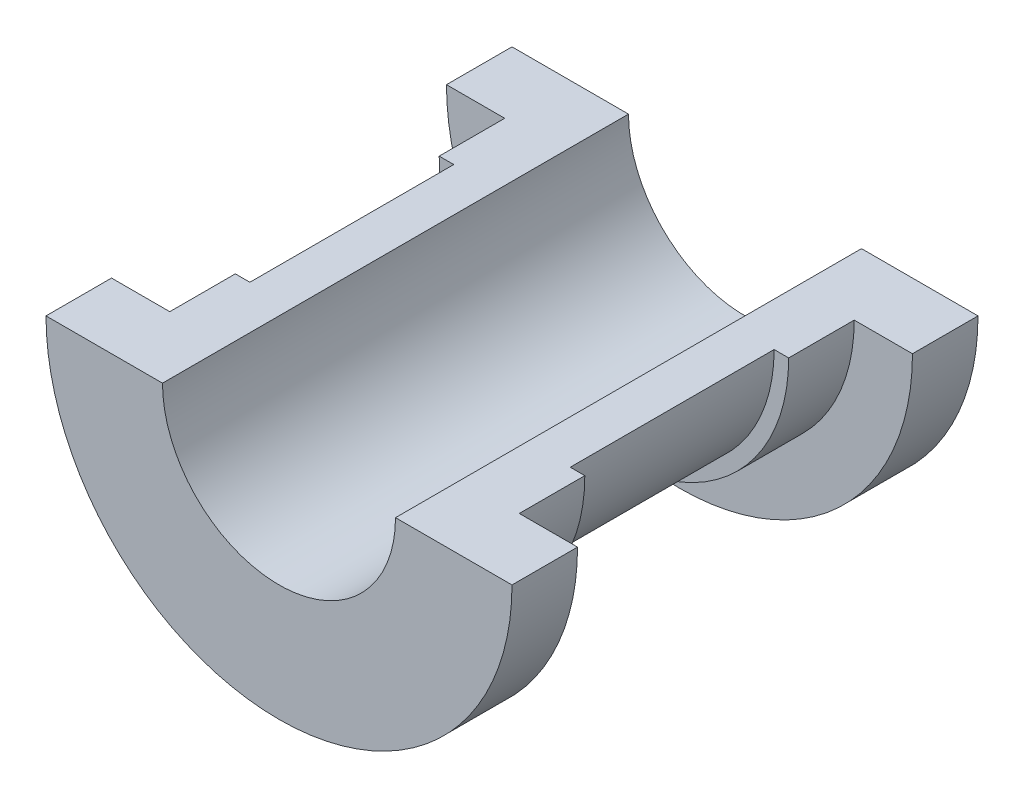
ISO-10303-21;
HEADER;
FILE_DESCRIPTION(('STEP AP214'),'2;1');
FILE_NAME('part.step','',(''),(''),'','','');
FILE_SCHEMA(('AUTOMOTIVE_DESIGN { 1 0 10303 214 1 1 1 1 }'));
ENDSEC;
DATA;
#1=APPLICATION_CONTEXT('core data for automotive mechanical design processes');
#2=APPLICATION_PROTOCOL_DEFINITION('international standard','automotive_design',2000,#1);
#3=PRODUCT_CONTEXT('',#1,'mechanical');
#4=PRODUCT('Part','Part','',(#3));
#5=PRODUCT_RELATED_PRODUCT_CATEGORY('part','',(#4));
#6=PRODUCT_DEFINITION_FORMATION('','',#4);
#7=PRODUCT_DEFINITION_CONTEXT('part definition',#1,'design');
#8=PRODUCT_DEFINITION('design','',#6,#7);
#9=PRODUCT_DEFINITION_SHAPE('','',#8);
#10=(LENGTH_UNIT() NAMED_UNIT(*) SI_UNIT(.MILLI.,.METRE.));
#11=(NAMED_UNIT(*) PLANE_ANGLE_UNIT() SI_UNIT($,.RADIAN.));
#12=(NAMED_UNIT(*) SI_UNIT($,.STERADIAN.) SOLID_ANGLE_UNIT());
#13=UNCERTAINTY_MEASURE_WITH_UNIT(LENGTH_MEASURE(1.E-05),#10,'distance_accuracy_value','');
#14=(GEOMETRIC_REPRESENTATION_CONTEXT(3) GLOBAL_UNCERTAINTY_ASSIGNED_CONTEXT((#13)) GLOBAL_UNIT_ASSIGNED_CONTEXT((#10,
#11,#12)) REPRESENTATION_CONTEXT('',''));
#15=CARTESIAN_POINT('',(0.,0.,0.));
#16=DIRECTION('',(0.,0.,1.));
#17=DIRECTION('',(1.,0.,0.));
#18=AXIS2_PLACEMENT_3D('',#15,#16,#17);
#19=CARTESIAN_POINT('',(0.,0.,7.));
#20=DIRECTION('',(0.,0.,-1.));
#21=DIRECTION('',(-1.,0.,0.));
#22=AXIS2_PLACEMENT_3D('',#19,#20,#21);
#23=CYLINDRICAL_SURFACE('',#22,22.);
#24=DIRECTION('',(0.,0.,-1.));
#25=VECTOR('',#24,1.);
#26=CARTESIAN_POINT('',(22.,0.,7.));
#27=LINE('',#26,#25);
#28=CARTESIAN_POINT('',(22.,0.,7.));
#29=VERTEX_POINT('',#28);
#30=CARTESIAN_POINT('',(22.,0.,-21.));
#31=VERTEX_POINT('',#30);
#32=EDGE_CURVE('E206',#29,#31,#27,.T.);
#33=ORIENTED_EDGE('',*,*,#32,.F.);
#34=CARTESIAN_POINT('',(0.,0.,7.));
#35=DIRECTION('',(0.,0.,1.));
#36=DIRECTION('',(1.,0.,0.));
#37=AXIS2_PLACEMENT_3D('',#34,#35,#36);
#38=CIRCLE('',#37,22.);
#39=CARTESIAN_POINT('',(-22.,0.,7.));
#40=VERTEX_POINT('',#39);
#41=EDGE_CURVE('E150',#40,#29,#38,.T.);
#42=ORIENTED_EDGE('',*,*,#41,.F.);
#43=DIRECTION('',(0.,0.,-1.));
#44=VECTOR('',#43,1.);
#45=CARTESIAN_POINT('',(-22.,0.,7.));
#46=LINE('',#45,#44);
#47=CARTESIAN_POINT('',(-22.,0.,-21.));
#48=VERTEX_POINT('',#47);
#49=EDGE_CURVE('E184',#48,#40,#46,.F.);
#50=ORIENTED_EDGE('',*,*,#49,.F.);
#51=CARTESIAN_POINT('',(0.,0.,-21.));
#52=DIRECTION('',(0.,0.,1.));
#53=DIRECTION('',(1.,0.,0.));
#54=AXIS2_PLACEMENT_3D('',#51,#52,#53);
#55=CIRCLE('',#54,22.);
#56=EDGE_CURVE('E167',#48,#31,#55,.T.);
#57=ORIENTED_EDGE('',*,*,#56,.T.);
#58=EDGE_LOOP('',(#33,#42,#50,#57));
#59=FACE_BOUND('',#58,.T.);
#60=ADVANCED_FACE('F37',(#59),#23,.T.);
#61=CARTESIAN_POINT('',(0.,0.,7.));
#62=DIRECTION('',(0.,0.,-1.));
#63=DIRECTION('',(-1.,0.,0.));
#64=AXIS2_PLACEMENT_3D('',#61,#62,#63);
#65=CYLINDRICAL_SURFACE('',#64,16.);
#66=CARTESIAN_POINT('',(0.,0.,25.));
#67=DIRECTION('',(0.,0.,-1.));
#68=DIRECTION('',(-1.,0.,0.));
#69=AXIS2_PLACEMENT_3D('',#66,#67,#68);
#70=CIRCLE('',#69,16.);
#71=CARTESIAN_POINT('',(16.,0.,25.));
#72=VERTEX_POINT('',#71);
#73=CARTESIAN_POINT('',(-16.,0.,25.));
#74=VERTEX_POINT('',#73);
#75=EDGE_CURVE('E162',#72,#74,#70,.T.);
#76=ORIENTED_EDGE('',*,*,#75,.F.);
#77=DIRECTION('',(0.,0.,-1.));
#78=VECTOR('',#77,1.);
#79=CARTESIAN_POINT('',(16.,0.,7.));
#80=LINE('',#79,#78);
#81=CARTESIAN_POINT('',(16.,0.,-39.));
#82=VERTEX_POINT('',#81);
#83=EDGE_CURVE('E209',#72,#82,#80,.T.);
#84=ORIENTED_EDGE('',*,*,#83,.T.);
#85=CARTESIAN_POINT('',(0.,0.,-39.));
#86=DIRECTION('',(0.,0.,-1.));
#87=DIRECTION('',(-1.,0.,0.));
#88=AXIS2_PLACEMENT_3D('',#85,#86,#87);
#89=CIRCLE('',#88,16.);
#90=CARTESIAN_POINT('',(-16.,0.,-39.));
#91=VERTEX_POINT('',#90);
#92=EDGE_CURVE('E134',#82,#91,#89,.T.);
#93=ORIENTED_EDGE('',*,*,#92,.T.);
#94=DIRECTION('',(0.,0.,-1.));
#95=VECTOR('',#94,1.);
#96=CARTESIAN_POINT('',(-16.,0.,7.));
#97=LINE('',#96,#95);
#98=EDGE_CURVE('E187',#91,#74,#97,.F.);
#99=ORIENTED_EDGE('',*,*,#98,.T.);
#100=EDGE_LOOP('',(#76,#84,#93,#99));
#101=FACE_BOUND('',#100,.T.);
#102=ADVANCED_FACE('F249',(#101),#65,.F.);
#103=CARTESIAN_POINT('',(0.,0.,16.));
#104=DIRECTION('',(0.,0.,-1.));
#105=DIRECTION('',(-1.,0.,0.));
#106=AXIS2_PLACEMENT_3D('',#103,#104,#105);
#107=CYLINDRICAL_SURFACE('',#106,24.);
#108=DIRECTION('',(0.,0.,-1.));
#109=VECTOR('',#108,1.);
#110=CARTESIAN_POINT('',(24.,0.,16.));
#111=LINE('',#110,#109);
#112=CARTESIAN_POINT('',(24.,0.,16.));
#113=VERTEX_POINT('',#112);
#114=CARTESIAN_POINT('',(24.,0.,7.));
#115=VERTEX_POINT('',#114);
#116=EDGE_CURVE('E202',#113,#115,#111,.T.);
#117=ORIENTED_EDGE('',*,*,#116,.F.);
#118=CARTESIAN_POINT('',(0.,0.,16.));
#119=DIRECTION('',(0.,0.,1.));
#120=DIRECTION('',(1.,0.,0.));
#121=AXIS2_PLACEMENT_3D('',#118,#119,#120);
#122=CIRCLE('',#121,24.);
#123=CARTESIAN_POINT('',(-24.,0.,16.));
#124=VERTEX_POINT('',#123);
#125=EDGE_CURVE('E151',#124,#113,#122,.T.);
#126=ORIENTED_EDGE('',*,*,#125,.F.);
#127=DIRECTION('',(0.,0.,-1.));
#128=VECTOR('',#127,1.);
#129=CARTESIAN_POINT('',(-24.,0.,16.));
#130=LINE('',#129,#128);
#131=CARTESIAN_POINT('',(-24.,0.,7.));
#132=VERTEX_POINT('',#131);
#133=EDGE_CURVE('E51',#132,#124,#130,.F.);
#134=ORIENTED_EDGE('',*,*,#133,.F.);
#135=CARTESIAN_POINT('',(0.,0.,7.));
#136=DIRECTION('',(0.,0.,1.));
#137=DIRECTION('',(1.,0.,0.));
#138=AXIS2_PLACEMENT_3D('',#135,#136,#137);
#139=CIRCLE('',#138,24.);
#140=EDGE_CURVE('E154',#132,#115,#139,.T.);
#141=ORIENTED_EDGE('',*,*,#140,.T.);
#142=EDGE_LOOP('',(#117,#126,#134,#141));
#143=FACE_BOUND('',#142,.T.);
#144=ADVANCED_FACE('F233',(#143),#107,.T.);
#145=CARTESIAN_POINT('',(0.,0.,7.));
#146=DIRECTION('',(0.,0.,1.));
#147=DIRECTION('',(1.,0.,0.));
#148=AXIS2_PLACEMENT_3D('',#145,#146,#147);
#149=PLANE('',#148);
#150=DIRECTION('',(-1.,0.,0.));
#151=VECTOR('',#150,1.);
#152=CARTESIAN_POINT('',(0.,0.,7.));
#153=LINE('',#152,#151);
#154=EDGE_CURVE('E58',#115,#29,#153,.T.);
#155=ORIENTED_EDGE('',*,*,#154,.F.);
#156=ORIENTED_EDGE('',*,*,#140,.F.);
#157=EDGE_CURVE('E183',#40,#132,#153,.T.);
#158=ORIENTED_EDGE('',*,*,#157,.F.);
#159=ORIENTED_EDGE('',*,*,#41,.T.);
#160=EDGE_LOOP('',(#155,#156,#158,#159));
#161=FACE_BOUND('',#160,.T.);
#162=ADVANCED_FACE('F236',(#161),#149,.F.);
#163=CARTESIAN_POINT('',(0.,0.,25.));
#164=DIRECTION('',(0.,0.,-1.));
#165=DIRECTION('',(-1.,0.,0.));
#166=AXIS2_PLACEMENT_3D('',#163,#164,#165);
#167=CYLINDRICAL_SURFACE('',#166,32.);
#168=DIRECTION('',(0.,0.,-1.));
#169=VECTOR('',#168,1.);
#170=CARTESIAN_POINT('',(32.,0.,25.));
#171=LINE('',#170,#169);
#172=CARTESIAN_POINT('',(32.,0.,25.));
#173=VERTEX_POINT('',#172);
#174=CARTESIAN_POINT('',(32.,0.,16.));
#175=VERTEX_POINT('',#174);
#176=EDGE_CURVE('E196',#173,#175,#171,.T.);
#177=ORIENTED_EDGE('',*,*,#176,.F.);
#178=CARTESIAN_POINT('',(0.,0.,25.));
#179=DIRECTION('',(0.,0.,1.));
#180=DIRECTION('',(1.,0.,0.));
#181=AXIS2_PLACEMENT_3D('',#178,#179,#180);
#182=CIRCLE('',#181,32.);
#183=CARTESIAN_POINT('',(-32.,0.,25.));
#184=VERTEX_POINT('',#183);
#185=EDGE_CURVE('E157',#184,#173,#182,.T.);
#186=ORIENTED_EDGE('',*,*,#185,.F.);
#187=DIRECTION('',(0.,0.,-1.));
#188=VECTOR('',#187,1.);
#189=CARTESIAN_POINT('',(-32.,0.,25.));
#190=LINE('',#189,#188);
#191=CARTESIAN_POINT('',(-32.,0.,16.));
#192=VERTEX_POINT('',#191);
#193=EDGE_CURVE('E178',#192,#184,#190,.F.);
#194=ORIENTED_EDGE('',*,*,#193,.F.);
#195=CARTESIAN_POINT('',(0.,0.,16.));
#196=DIRECTION('',(0.,0.,1.));
#197=DIRECTION('',(1.,0.,0.));
#198=AXIS2_PLACEMENT_3D('',#195,#196,#197);
#199=CIRCLE('',#198,32.);
#200=EDGE_CURVE('E159',#192,#175,#199,.T.);
#201=ORIENTED_EDGE('',*,*,#200,.T.);
#202=EDGE_LOOP('',(#177,#186,#194,#201));
#203=FACE_BOUND('',#202,.T.);
#204=ADVANCED_FACE('F229',(#203),#167,.T.);
#205=CARTESIAN_POINT('',(0.,0.,16.));
#206=DIRECTION('',(0.,0.,1.));
#207=DIRECTION('',(1.,0.,0.));
#208=AXIS2_PLACEMENT_3D('',#205,#206,#207);
#209=PLANE('',#208);
#210=DIRECTION('',(-1.,0.,0.));
#211=VECTOR('',#210,1.);
#212=CARTESIAN_POINT('',(0.,0.,16.));
#213=LINE('',#212,#211);
#214=EDGE_CURVE('E199',#175,#113,#213,.T.);
#215=ORIENTED_EDGE('',*,*,#214,.F.);
#216=ORIENTED_EDGE('',*,*,#200,.F.);
#217=EDGE_CURVE('E181',#124,#192,#213,.T.);
#218=ORIENTED_EDGE('',*,*,#217,.F.);
#219=ORIENTED_EDGE('',*,*,#125,.T.);
#220=EDGE_LOOP('',(#215,#216,#218,#219));
#221=FACE_BOUND('',#220,.T.);
#222=ADVANCED_FACE('F232',(#221),#209,.F.);
#223=CARTESIAN_POINT('',(0.,0.,-30.));
#224=DIRECTION('',(0.,0.,1.));
#225=DIRECTION('',(-1.,0.,0.));
#226=AXIS2_PLACEMENT_3D('',#223,#224,#225);
#227=CYLINDRICAL_SURFACE('',#226,24.);
#228=DIRECTION('',(0.,0.,1.));
#229=VECTOR('',#228,1.);
#230=CARTESIAN_POINT('',(-24.,0.,-30.));
#231=LINE('',#230,#229);
#232=CARTESIAN_POINT('',(-24.,0.,-30.));
#233=VERTEX_POINT('',#232);
#234=CARTESIAN_POINT('',(-24.,0.,-21.));
#235=VERTEX_POINT('',#234);
#236=EDGE_CURVE('E190',#233,#235,#231,.T.);
#237=ORIENTED_EDGE('',*,*,#236,.F.);
#238=CARTESIAN_POINT('',(0.,0.,-30.));
#239=DIRECTION('',(0.,0.,1.));
#240=DIRECTION('',(1.,0.,0.));
#241=AXIS2_PLACEMENT_3D('',#238,#239,#240);
#242=CIRCLE('',#241,24.);
#243=CARTESIAN_POINT('',(24.,0.,-30.));
#244=VERTEX_POINT('',#243);
#245=EDGE_CURVE('E170',#233,#244,#242,.T.);
#246=ORIENTED_EDGE('',*,*,#245,.T.);
#247=DIRECTION('',(0.,0.,1.));
#248=VECTOR('',#247,1.);
#249=CARTESIAN_POINT('',(24.,0.,-30.));
#250=LINE('',#249,#248);
#251=CARTESIAN_POINT('',(24.,0.,-21.));
#252=VERTEX_POINT('',#251);
#253=EDGE_CURVE('E143',#252,#244,#250,.F.);
#254=ORIENTED_EDGE('',*,*,#253,.F.);
#255=CARTESIAN_POINT('',(0.,0.,-21.));
#256=DIRECTION('',(0.,0.,1.));
#257=DIRECTION('',(1.,0.,0.));
#258=AXIS2_PLACEMENT_3D('',#255,#256,#257);
#259=CIRCLE('',#258,24.);
#260=EDGE_CURVE('E171',#235,#252,#259,.T.);
#261=ORIENTED_EDGE('',*,*,#260,.F.);
#262=EDGE_LOOP('',(#237,#246,#254,#261));
#263=FACE_BOUND('',#262,.T.);
#264=ADVANCED_FACE('F244',(#263),#227,.T.);
#265=CARTESIAN_POINT('',(0.,0.,-21.));
#266=DIRECTION('',(0.,0.,-1.));
#267=DIRECTION('',(1.,0.,0.));
#268=AXIS2_PLACEMENT_3D('',#265,#266,#267);
#269=PLANE('',#268);
#270=DIRECTION('',(1.,0.,0.));
#271=VECTOR('',#270,1.);
#272=CARTESIAN_POINT('',(0.,0.,-21.));
#273=LINE('',#272,#271);
#274=EDGE_CURVE('E189',#235,#48,#273,.T.);
#275=ORIENTED_EDGE('',*,*,#274,.F.);
#276=ORIENTED_EDGE('',*,*,#260,.T.);
#277=EDGE_CURVE('E211',#31,#252,#273,.T.);
#278=ORIENTED_EDGE('',*,*,#277,.F.);
#279=ORIENTED_EDGE('',*,*,#56,.F.);
#280=EDGE_LOOP('',(#275,#276,#278,#279));
#281=FACE_BOUND('',#280,.T.);
#282=ADVANCED_FACE('F240',(#281),#269,.F.);
#283=CARTESIAN_POINT('',(0.,0.,-39.));
#284=DIRECTION('',(0.,0.,1.));
#285=DIRECTION('',(-1.,0.,0.));
#286=AXIS2_PLACEMENT_3D('',#283,#284,#285);
#287=CYLINDRICAL_SURFACE('',#286,32.);
#288=DIRECTION('',(0.,0.,1.));
#289=VECTOR('',#288,1.);
#290=CARTESIAN_POINT('',(-32.,0.,-39.));
#291=LINE('',#290,#289);
#292=CARTESIAN_POINT('',(-32.,0.,-39.));
#293=VERTEX_POINT('',#292);
#294=CARTESIAN_POINT('',(-32.,0.,-30.));
#295=VERTEX_POINT('',#294);
#296=EDGE_CURVE('E194',#293,#295,#291,.T.);
#297=ORIENTED_EDGE('',*,*,#296,.F.);
#298=CARTESIAN_POINT('',(0.,0.,-39.));
#299=DIRECTION('',(0.,0.,1.));
#300=DIRECTION('',(1.,0.,0.));
#301=AXIS2_PLACEMENT_3D('',#298,#299,#300);
#302=CIRCLE('',#301,32.);
#303=CARTESIAN_POINT('',(32.,0.,-39.));
#304=VERTEX_POINT('',#303);
#305=EDGE_CURVE('E133',#293,#304,#302,.T.);
#306=ORIENTED_EDGE('',*,*,#305,.T.);
#307=DIRECTION('',(0.,0.,1.));
#308=VECTOR('',#307,1.);
#309=CARTESIAN_POINT('',(32.,0.,-39.));
#310=LINE('',#309,#308);
#311=CARTESIAN_POINT('',(32.,0.,-30.));
#312=VERTEX_POINT('',#311);
#313=EDGE_CURVE('E138',#312,#304,#310,.F.);
#314=ORIENTED_EDGE('',*,*,#313,.F.);
#315=CARTESIAN_POINT('',(0.,0.,-30.));
#316=DIRECTION('',(0.,0.,1.));
#317=DIRECTION('',(1.,0.,0.));
#318=AXIS2_PLACEMENT_3D('',#315,#316,#317);
#319=CIRCLE('',#318,32.);
#320=EDGE_CURVE('E126',#295,#312,#319,.T.);
#321=ORIENTED_EDGE('',*,*,#320,.F.);
#322=EDGE_LOOP('',(#297,#306,#314,#321));
#323=FACE_BOUND('',#322,.T.);
#324=ADVANCED_FACE('F139',(#323),#287,.T.);
#325=CARTESIAN_POINT('',(0.,0.,-39.));
#326=DIRECTION('',(0.,0.,-1.));
#327=DIRECTION('',(1.,0.,0.));
#328=AXIS2_PLACEMENT_3D('',#325,#326,#327);
#329=PLANE('',#328);
#330=ORIENTED_EDGE('',*,*,#305,.F.);
#331=DIRECTION('',(1.,0.,0.));
#332=VECTOR('',#331,1.);
#333=CARTESIAN_POINT('',(0.,0.,-39.));
#334=LINE('',#333,#332);
#335=EDGE_CURVE('E193',#293,#91,#334,.T.);
#336=ORIENTED_EDGE('',*,*,#335,.T.);
#337=ORIENTED_EDGE('',*,*,#92,.F.);
#338=EDGE_CURVE('E213',#82,#304,#334,.T.);
#339=ORIENTED_EDGE('',*,*,#338,.T.);
#340=EDGE_LOOP('',(#330,#336,#337,#339));
#341=FACE_BOUND('',#340,.T.);
#342=ADVANCED_FACE('F246',(#341),#329,.T.);
#343=CARTESIAN_POINT('',(0.,0.,-30.));
#344=DIRECTION('',(0.,0.,-1.));
#345=DIRECTION('',(1.,0.,0.));
#346=AXIS2_PLACEMENT_3D('',#343,#344,#345);
#347=PLANE('',#346);
#348=DIRECTION('',(1.,0.,0.));
#349=VECTOR('',#348,1.);
#350=CARTESIAN_POINT('',(0.,0.,-30.));
#351=LINE('',#350,#349);
#352=EDGE_CURVE('E11',#295,#233,#351,.T.);
#353=ORIENTED_EDGE('',*,*,#352,.F.);
#354=ORIENTED_EDGE('',*,*,#320,.T.);
#355=EDGE_CURVE('E40',#244,#312,#351,.T.);
#356=ORIENTED_EDGE('',*,*,#355,.F.);
#357=ORIENTED_EDGE('',*,*,#245,.F.);
#358=EDGE_LOOP('',(#353,#354,#356,#357));
#359=FACE_BOUND('',#358,.T.);
#360=ADVANCED_FACE('F128',(#359),#347,.F.);
#361=CARTESIAN_POINT('',(0.,0.,25.));
#362=DIRECTION('',(0.,0.,1.));
#363=DIRECTION('',(1.,0.,0.));
#364=AXIS2_PLACEMENT_3D('',#361,#362,#363);
#365=PLANE('',#364);
#366=DIRECTION('',(1.,0.,0.));
#367=VECTOR('',#366,1.);
#368=CARTESIAN_POINT('',(-35.372068518765,0.,25.));
#369=LINE('',#368,#367);
#370=EDGE_CURVE('E144',#184,#74,#369,.T.);
#371=ORIENTED_EDGE('',*,*,#370,.F.);
#372=ORIENTED_EDGE('',*,*,#185,.T.);
#373=EDGE_CURVE('E216',#72,#173,#369,.T.);
#374=ORIENTED_EDGE('',*,*,#373,.F.);
#375=ORIENTED_EDGE('',*,*,#75,.T.);
#376=EDGE_LOOP('',(#371,#372,#374,#375));
#377=FACE_BOUND('',#376,.T.);
#378=ADVANCED_FACE('F226',(#377),#365,.T.);
#379=CARTESIAN_POINT('',(-35.372068518765,0.,25.));
#380=DIRECTION('',(0.,1.,0.));
#381=DIRECTION('',(0.,0.,1.));
#382=AXIS2_PLACEMENT_3D('',#379,#380,#381);
#383=PLANE('',#382);
#384=ORIENTED_EDGE('',*,*,#373,.T.);
#385=ORIENTED_EDGE('',*,*,#176,.T.);
#386=ORIENTED_EDGE('',*,*,#214,.T.);
#387=ORIENTED_EDGE('',*,*,#116,.T.);
#388=ORIENTED_EDGE('',*,*,#154,.T.);
#389=ORIENTED_EDGE('',*,*,#32,.T.);
#390=ORIENTED_EDGE('',*,*,#277,.T.);
#391=ORIENTED_EDGE('',*,*,#253,.T.);
#392=ORIENTED_EDGE('',*,*,#355,.T.);
#393=ORIENTED_EDGE('',*,*,#313,.T.);
#394=ORIENTED_EDGE('',*,*,#338,.F.);
#395=ORIENTED_EDGE('',*,*,#83,.F.);
#396=EDGE_LOOP('',(#384,#385,#386,#387,#388,#389,#390,#391,#392,#393,#394,#395));
#397=FACE_BOUND('',#396,.T.);
#398=ADVANCED_FACE('F148',(#397),#383,.T.);
#399=ORIENTED_EDGE('',*,*,#217,.T.);
#400=ORIENTED_EDGE('',*,*,#193,.T.);
#401=ORIENTED_EDGE('',*,*,#370,.T.);
#402=ORIENTED_EDGE('',*,*,#98,.F.);
#403=ORIENTED_EDGE('',*,*,#335,.F.);
#404=ORIENTED_EDGE('',*,*,#296,.T.);
#405=ORIENTED_EDGE('',*,*,#352,.T.);
#406=ORIENTED_EDGE('',*,*,#236,.T.);
#407=ORIENTED_EDGE('',*,*,#274,.T.);
#408=ORIENTED_EDGE('',*,*,#49,.T.);
#409=ORIENTED_EDGE('',*,*,#157,.T.);
#410=ORIENTED_EDGE('',*,*,#133,.T.);
#411=EDGE_LOOP('',(#399,#400,#401,#402,#403,#404,#405,#406,#407,#408,#409,#410));
#412=FACE_BOUND('',#411,.T.);
#413=ADVANCED_FACE('F222',(#412),#383,.T.);
#414=CLOSED_SHELL('',(#60,#102,#144,#162,#204,#222,#264,#282,#324,#342,#360,#378,#398,#413));
#415=MANIFOLD_SOLID_BREP('B2',#414);
#416=ADVANCED_BREP_SHAPE_REPRESENTATION('',(#18,#415),#14);
#417=SHAPE_DEFINITION_REPRESENTATION(#9,#416);
ENDSEC;
END-ISO-10303-21;
